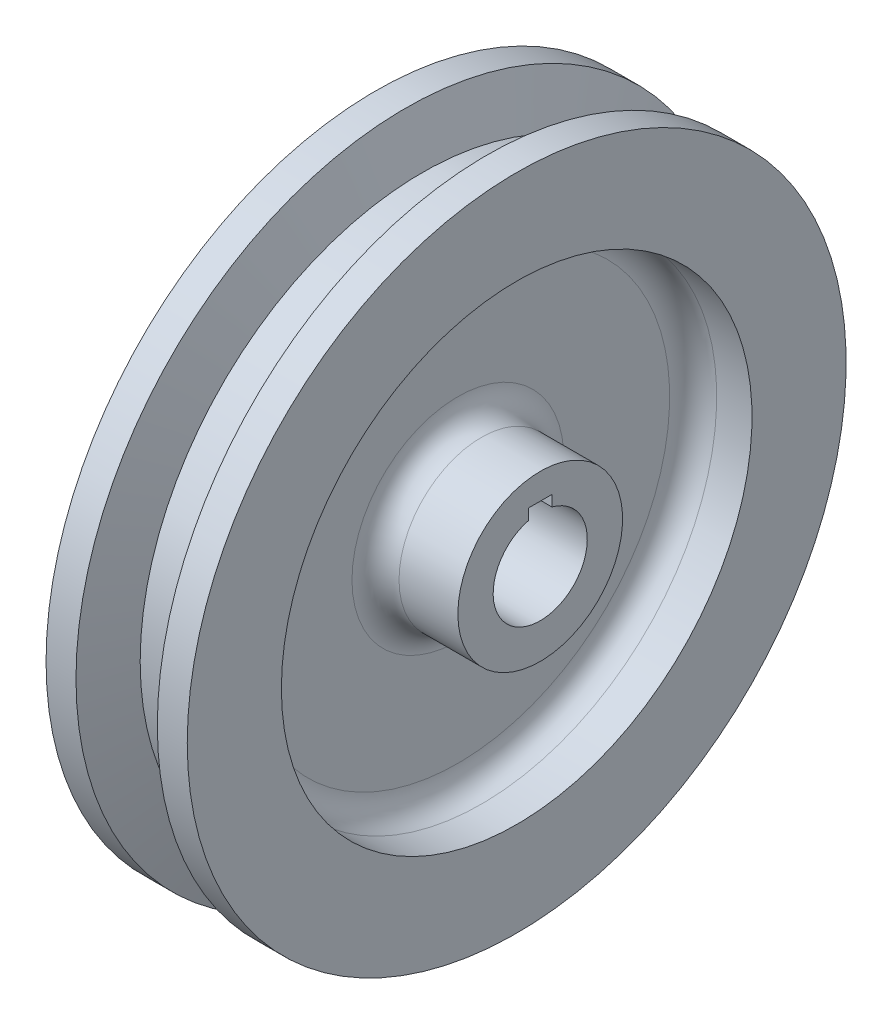
ISO-10303-21;
HEADER;
FILE_DESCRIPTION(('STEP AP214'),'2;1');
FILE_NAME('part.step','',(''),(''),'','','');
FILE_SCHEMA(('AUTOMOTIVE_DESIGN { 1 0 10303 214 1 1 1 1 }'));
ENDSEC;
DATA;
#1=APPLICATION_CONTEXT('core data for automotive mechanical design processes');
#2=APPLICATION_PROTOCOL_DEFINITION('international standard','automotive_design',2000,#1);
#3=PRODUCT_CONTEXT('',#1,'mechanical');
#4=PRODUCT('Part','Part','',(#3));
#5=PRODUCT_RELATED_PRODUCT_CATEGORY('part','',(#4));
#6=PRODUCT_DEFINITION_FORMATION('','',#4);
#7=PRODUCT_DEFINITION_CONTEXT('part definition',#1,'design');
#8=PRODUCT_DEFINITION('design','',#6,#7);
#9=PRODUCT_DEFINITION_SHAPE('','',#8);
#10=(LENGTH_UNIT() NAMED_UNIT(*) SI_UNIT(.MILLI.,.METRE.));
#11=(NAMED_UNIT(*) PLANE_ANGLE_UNIT() SI_UNIT($,.RADIAN.));
#12=(NAMED_UNIT(*) SI_UNIT($,.STERADIAN.) SOLID_ANGLE_UNIT());
#13=UNCERTAINTY_MEASURE_WITH_UNIT(LENGTH_MEASURE(1.E-05),#10,'distance_accuracy_value','');
#14=(GEOMETRIC_REPRESENTATION_CONTEXT(3) GLOBAL_UNCERTAINTY_ASSIGNED_CONTEXT((#13)) GLOBAL_UNIT_ASSIGNED_CONTEXT((#10,
#11,#12)) REPRESENTATION_CONTEXT('',''));
#15=CARTESIAN_POINT('',(0.,0.,0.));
#16=DIRECTION('',(0.,0.,1.));
#17=DIRECTION('',(1.,0.,0.));
#18=AXIS2_PLACEMENT_3D('',#15,#16,#17);
#19=CARTESIAN_POINT('',(-25.4,0.,0.));
#20=DIRECTION('',(1.,0.,0.));
#21=DIRECTION('',(0.,0.,-1.));
#22=AXIS2_PLACEMENT_3D('',#19,#20,#21);
#23=PLANE('',#22);
#24=CARTESIAN_POINT('',(-25.4,0.,0.));
#25=DIRECTION('',(-1.,0.,0.));
#26=DIRECTION('',(0.,0.,1.));
#27=AXIS2_PLACEMENT_3D('',#24,#25,#26);
#28=CIRCLE('',#27,12.7);
#29=CARTESIAN_POINT('',(-25.4,12.2967221242085,-3.175));
#30=VERTEX_POINT('',#29);
#31=CARTESIAN_POINT('',(-25.4,12.2967221242085,3.175));
#32=VERTEX_POINT('',#31);
#33=EDGE_CURVE('E115',#30,#32,#28,.T.);
#34=ORIENTED_EDGE('',*,*,#33,.F.);
#35=DIRECTION('',(0.,-1.,0.));
#36=VECTOR('',#35,1.);
#37=CARTESIAN_POINT('',(-25.4,15.24,-3.175));
#38=LINE('',#37,#36);
#39=CARTESIAN_POINT('',(-25.4,15.24,-3.175));
#40=VERTEX_POINT('',#39);
#41=EDGE_CURVE('E55',#40,#30,#38,.T.);
#42=ORIENTED_EDGE('',*,*,#41,.F.);
#43=DIRECTION('',(0.,0.,-1.));
#44=VECTOR('',#43,1.);
#45=CARTESIAN_POINT('',(-25.4,15.24,-3.175));
#46=LINE('',#45,#44);
#47=CARTESIAN_POINT('',(-25.4,15.24,3.175));
#48=VERTEX_POINT('',#47);
#49=EDGE_CURVE('E102',#48,#40,#46,.T.);
#50=ORIENTED_EDGE('',*,*,#49,.F.);
#51=DIRECTION('',(0.,1.,0.));
#52=VECTOR('',#51,1.);
#53=CARTESIAN_POINT('',(-25.4,15.24,3.175));
#54=LINE('',#53,#52);
#55=EDGE_CURVE('E106',#32,#48,#54,.T.);
#56=ORIENTED_EDGE('',*,*,#55,.F.);
#57=EDGE_LOOP('',(#34,#42,#50,#56));
#58=FACE_BOUND('',#57,.T.);
#59=CARTESIAN_POINT('',(-25.4,0.,0.));
#60=DIRECTION('',(-1.,0.,0.));
#61=DIRECTION('',(0.,0.,1.));
#62=AXIS2_PLACEMENT_3D('',#59,#60,#61);
#63=CIRCLE('',#62,22.225);
#64=CARTESIAN_POINT('',(-25.4,0.,22.225));
#65=VERTEX_POINT('',#64);
#66=EDGE_CURVE('E165',#65,#65,#63,.T.);
#67=ORIENTED_EDGE('',*,*,#66,.T.);
#68=EDGE_LOOP('',(#67));
#69=FACE_BOUND('',#68,.T.);
#70=ADVANCED_FACE('F39',(#58,#69),#23,.F.);
#71=CARTESIAN_POINT('',(-25.4,0.,0.));
#72=DIRECTION('',(-1.,0.,0.));
#73=DIRECTION('',(0.,0.,1.));
#74=AXIS2_PLACEMENT_3D('',#71,#72,#73);
#75=CYLINDRICAL_SURFACE('',#74,22.225);
#76=CARTESIAN_POINT('',(-9.525,0.,0.));
#77=DIRECTION('',(1.,0.,0.));
#78=DIRECTION('',(0.,0.,-1.));
#79=AXIS2_PLACEMENT_3D('',#76,#77,#78);
#80=CIRCLE('',#79,22.225);
#81=CARTESIAN_POINT('',(-9.525,0.,-22.225));
#82=VERTEX_POINT('',#81);
#83=EDGE_CURVE('E181',#82,#82,#80,.F.);
#84=ORIENTED_EDGE('',*,*,#83,.T.);
#85=EDGE_LOOP('',(#84));
#86=FACE_BOUND('',#85,.T.);
#87=ORIENTED_EDGE('',*,*,#66,.F.);
#88=EDGE_LOOP('',(#87));
#89=FACE_BOUND('',#88,.T.);
#90=ADVANCED_FACE('F224',(#86,#89),#75,.T.);
#91=CARTESIAN_POINT('',(-3.175,22.225,0.));
#92=DIRECTION('',(1.,0.,0.));
#93=DIRECTION('',(0.,0.,-1.));
#94=AXIS2_PLACEMENT_3D('',#91,#92,#93);
#95=PLANE('',#94);
#96=CARTESIAN_POINT('',(-3.175,0.,0.));
#97=DIRECTION('',(1.,0.,0.));
#98=DIRECTION('',(0.,0.,-1.));
#99=AXIS2_PLACEMENT_3D('',#96,#97,#98);
#100=CIRCLE('',#99,57.15);
#101=CARTESIAN_POINT('',(-3.175,0.,-57.15));
#102=VERTEX_POINT('',#101);
#103=EDGE_CURVE('E173',#102,#102,#100,.F.);
#104=ORIENTED_EDGE('',*,*,#103,.T.);
#105=EDGE_LOOP('',(#104));
#106=FACE_BOUND('',#105,.T.);
#107=CARTESIAN_POINT('',(-3.175,0.,0.));
#108=DIRECTION('',(1.,0.,0.));
#109=DIRECTION('',(0.,0.,-1.));
#110=AXIS2_PLACEMENT_3D('',#107,#108,#109);
#111=CIRCLE('',#110,28.575);
#112=CARTESIAN_POINT('',(-3.175,0.,-28.575));
#113=VERTEX_POINT('',#112);
#114=EDGE_CURVE('E169',#113,#113,#111,.T.);
#115=ORIENTED_EDGE('',*,*,#114,.T.);
#116=EDGE_LOOP('',(#115));
#117=FACE_BOUND('',#116,.T.);
#118=ADVANCED_FACE('F230',(#106,#117),#95,.F.);
#119=CARTESIAN_POINT('',(-25.4,0.,0.));
#120=DIRECTION('',(-1.,0.,0.));
#121=DIRECTION('',(0.,0.,1.));
#122=AXIS2_PLACEMENT_3D('',#119,#120,#121);
#123=CYLINDRICAL_SURFACE('',#122,63.5);
#124=CARTESIAN_POINT('',(-9.525,0.,0.));
#125=DIRECTION('',(1.,0.,0.));
#126=DIRECTION('',(0.,0.,-1.));
#127=AXIS2_PLACEMENT_3D('',#124,#125,#126);
#128=CIRCLE('',#127,63.5);
#129=CARTESIAN_POINT('',(-9.525,0.,-63.5));
#130=VERTEX_POINT('',#129);
#131=EDGE_CURVE('E177',#130,#130,#128,.T.);
#132=ORIENTED_EDGE('',*,*,#131,.T.);
#133=EDGE_LOOP('',(#132));
#134=FACE_BOUND('',#133,.T.);
#135=CARTESIAN_POINT('',(-19.05,0.,0.));
#136=DIRECTION('',(-1.,0.,0.));
#137=DIRECTION('',(0.,0.,1.));
#138=AXIS2_PLACEMENT_3D('',#135,#136,#137);
#139=CIRCLE('',#138,63.5);
#140=CARTESIAN_POINT('',(-19.05,0.,63.5));
#141=VERTEX_POINT('',#140);
#142=EDGE_CURVE('E161',#141,#141,#139,.T.);
#143=ORIENTED_EDGE('',*,*,#142,.T.);
#144=EDGE_LOOP('',(#143));
#145=FACE_BOUND('',#144,.T.);
#146=ADVANCED_FACE('F251',(#134,#145),#123,.F.);
#147=CARTESIAN_POINT('',(-19.05,63.5,0.));
#148=DIRECTION('',(1.,0.,0.));
#149=DIRECTION('',(0.,0.,-1.));
#150=AXIS2_PLACEMENT_3D('',#147,#148,#149);
#151=PLANE('',#150);
#152=ORIENTED_EDGE('',*,*,#142,.F.);
#153=EDGE_LOOP('',(#152));
#154=FACE_BOUND('',#153,.T.);
#155=CARTESIAN_POINT('',(-19.05,0.,0.));
#156=DIRECTION('',(-1.,0.,0.));
#157=DIRECTION('',(0.,0.,1.));
#158=AXIS2_PLACEMENT_3D('',#155,#156,#157);
#159=CIRCLE('',#158,88.9);
#160=CARTESIAN_POINT('',(-19.05,0.,88.9));
#161=VERTEX_POINT('',#160);
#162=EDGE_CURVE('E157',#161,#161,#159,.T.);
#163=ORIENTED_EDGE('',*,*,#162,.T.);
#164=EDGE_LOOP('',(#163));
#165=FACE_BOUND('',#164,.T.);
#166=ADVANCED_FACE('F256',(#154,#165),#151,.F.);
#167=CARTESIAN_POINT('',(-25.4,0.,0.));
#168=DIRECTION('',(-1.,0.,0.));
#169=DIRECTION('',(0.,0.,1.));
#170=AXIS2_PLACEMENT_3D('',#167,#168,#169);
#171=CYLINDRICAL_SURFACE('',#170,88.9);
#172=ORIENTED_EDGE('',*,*,#162,.F.);
#173=EDGE_LOOP('',(#172));
#174=FACE_BOUND('',#173,.T.);
#175=CARTESIAN_POINT('',(-10.9724219751808,0.,0.));
#176=DIRECTION('',(-1.,0.,0.));
#177=DIRECTION('',(0.,0.,1.));
#178=AXIS2_PLACEMENT_3D('',#175,#176,#177);
#179=CIRCLE('',#178,88.9);
#180=CARTESIAN_POINT('',(-10.9724219751808,0.,88.9));
#181=VERTEX_POINT('',#180);
#182=EDGE_CURVE('E153',#181,#181,#179,.T.);
#183=ORIENTED_EDGE('',*,*,#182,.T.);
#184=EDGE_LOOP('',(#183));
#185=FACE_BOUND('',#184,.T.);
#186=ADVANCED_FACE('F262',(#174,#185),#171,.T.);
#187=CARTESIAN_POINT('',(-6.35,0.,0.));
#188=DIRECTION('',(-1.,0.,0.));
#189=DIRECTION('',(0.,0.,1.));
#190=AXIS2_PLACEMENT_3D('',#187,#188,#189);
#191=CONICAL_SURFACE('',#190,76.2,1.22173047639603);
#192=ORIENTED_EDGE('',*,*,#182,.F.);
#193=EDGE_LOOP('',(#192));
#194=FACE_BOUND('',#193,.T.);
#195=CARTESIAN_POINT('',(-6.35,0.,0.));
#196=DIRECTION('',(-1.,0.,0.));
#197=DIRECTION('',(0.,0.,1.));
#198=AXIS2_PLACEMENT_3D('',#195,#196,#197);
#199=CIRCLE('',#198,76.2);
#200=CARTESIAN_POINT('',(-6.35,0.,76.2));
#201=VERTEX_POINT('',#200);
#202=EDGE_CURVE('E149',#201,#201,#199,.T.);
#203=ORIENTED_EDGE('',*,*,#202,.T.);
#204=EDGE_LOOP('',(#203));
#205=FACE_BOUND('',#204,.T.);
#206=ADVANCED_FACE('F266',(#194,#205),#191,.T.);
#207=CARTESIAN_POINT('',(-25.4,0.,0.));
#208=DIRECTION('',(-1.,0.,0.));
#209=DIRECTION('',(0.,0.,1.));
#210=AXIS2_PLACEMENT_3D('',#207,#208,#209);
#211=CYLINDRICAL_SURFACE('',#210,76.2);
#212=ORIENTED_EDGE('',*,*,#202,.F.);
#213=EDGE_LOOP('',(#212));
#214=FACE_BOUND('',#213,.T.);
#215=CARTESIAN_POINT('',(6.35,0.,0.));
#216=DIRECTION('',(-1.,0.,0.));
#217=DIRECTION('',(0.,0.,1.));
#218=AXIS2_PLACEMENT_3D('',#215,#216,#217);
#219=CIRCLE('',#218,76.2);
#220=CARTESIAN_POINT('',(6.35,0.,76.2));
#221=VERTEX_POINT('',#220);
#222=EDGE_CURVE('E145',#221,#221,#219,.T.);
#223=ORIENTED_EDGE('',*,*,#222,.T.);
#224=EDGE_LOOP('',(#223));
#225=FACE_BOUND('',#224,.T.);
#226=ADVANCED_FACE('F270',(#214,#225),#211,.T.);
#227=CARTESIAN_POINT('',(10.9724219751808,0.,0.));
#228=DIRECTION('',(1.,0.,0.));
#229=DIRECTION('',(0.,0.,-1.));
#230=AXIS2_PLACEMENT_3D('',#227,#228,#229);
#231=CONICAL_SURFACE('',#230,88.9,1.22173047639603);
#232=ORIENTED_EDGE('',*,*,#222,.F.);
#233=EDGE_LOOP('',(#232));
#234=FACE_BOUND('',#233,.T.);
#235=CARTESIAN_POINT('',(10.9724219751808,0.,0.));
#236=DIRECTION('',(-1.,0.,0.));
#237=DIRECTION('',(0.,0.,1.));
#238=AXIS2_PLACEMENT_3D('',#235,#236,#237);
#239=CIRCLE('',#238,88.9);
#240=CARTESIAN_POINT('',(10.9724219751808,0.,88.9));
#241=VERTEX_POINT('',#240);
#242=EDGE_CURVE('E141',#241,#241,#239,.T.);
#243=ORIENTED_EDGE('',*,*,#242,.T.);
#244=EDGE_LOOP('',(#243));
#245=FACE_BOUND('',#244,.T.);
#246=ADVANCED_FACE('F219',(#234,#245),#231,.T.);
#247=CARTESIAN_POINT('',(-25.4,0.,0.));
#248=DIRECTION('',(-1.,0.,0.));
#249=DIRECTION('',(0.,0.,1.));
#250=AXIS2_PLACEMENT_3D('',#247,#248,#249);
#251=CYLINDRICAL_SURFACE('',#250,88.9);
#252=ORIENTED_EDGE('',*,*,#242,.F.);
#253=EDGE_LOOP('',(#252));
#254=FACE_BOUND('',#253,.T.);
#255=CARTESIAN_POINT('',(19.05,0.,0.));
#256=DIRECTION('',(-1.,0.,0.));
#257=DIRECTION('',(0.,0.,1.));
#258=AXIS2_PLACEMENT_3D('',#255,#256,#257);
#259=CIRCLE('',#258,88.9);
#260=CARTESIAN_POINT('',(19.05,0.,88.9));
#261=VERTEX_POINT('',#260);
#262=EDGE_CURVE('E137',#261,#261,#259,.T.);
#263=ORIENTED_EDGE('',*,*,#262,.T.);
#264=EDGE_LOOP('',(#263));
#265=FACE_BOUND('',#264,.T.);
#266=ADVANCED_FACE('F213',(#254,#265),#251,.T.);
#267=CARTESIAN_POINT('',(19.05,88.9,0.));
#268=DIRECTION('',(-1.,0.,0.));
#269=DIRECTION('',(0.,0.,1.));
#270=AXIS2_PLACEMENT_3D('',#267,#268,#269);
#271=PLANE('',#270);
#272=ORIENTED_EDGE('',*,*,#262,.F.);
#273=EDGE_LOOP('',(#272));
#274=FACE_BOUND('',#273,.T.);
#275=CARTESIAN_POINT('',(19.05,0.,0.));
#276=DIRECTION('',(-1.,0.,0.));
#277=DIRECTION('',(0.,0.,1.));
#278=AXIS2_PLACEMENT_3D('',#275,#276,#277);
#279=CIRCLE('',#278,63.5);
#280=CARTESIAN_POINT('',(19.05,0.,63.5));
#281=VERTEX_POINT('',#280);
#282=EDGE_CURVE('E133',#281,#281,#279,.T.);
#283=ORIENTED_EDGE('',*,*,#282,.T.);
#284=EDGE_LOOP('',(#283));
#285=FACE_BOUND('',#284,.T.);
#286=ADVANCED_FACE('F208',(#274,#285),#271,.F.);
#287=CARTESIAN_POINT('',(-25.4,0.,0.));
#288=DIRECTION('',(-1.,0.,0.));
#289=DIRECTION('',(0.,0.,1.));
#290=AXIS2_PLACEMENT_3D('',#287,#288,#289);
#291=CYLINDRICAL_SURFACE('',#290,63.5);
#292=CARTESIAN_POINT('',(9.525,0.,0.));
#293=DIRECTION('',(-1.,0.,0.));
#294=DIRECTION('',(0.,0.,1.));
#295=AXIS2_PLACEMENT_3D('',#292,#293,#294);
#296=CIRCLE('',#295,63.5);
#297=CARTESIAN_POINT('',(9.525,0.,63.5));
#298=VERTEX_POINT('',#297);
#299=EDGE_CURVE('E185',#298,#298,#296,.T.);
#300=ORIENTED_EDGE('',*,*,#299,.T.);
#301=EDGE_LOOP('',(#300));
#302=FACE_BOUND('',#301,.T.);
#303=ORIENTED_EDGE('',*,*,#282,.F.);
#304=EDGE_LOOP('',(#303));
#305=FACE_BOUND('',#304,.T.);
#306=ADVANCED_FACE('F205',(#302,#305),#291,.F.);
#307=CARTESIAN_POINT('',(3.175,22.225,0.));
#308=DIRECTION('',(-1.,0.,0.));
#309=DIRECTION('',(0.,0.,1.));
#310=AXIS2_PLACEMENT_3D('',#307,#308,#309);
#311=PLANE('',#310);
#312=CARTESIAN_POINT('',(3.175,0.,0.));
#313=DIRECTION('',(-1.,0.,0.));
#314=DIRECTION('',(0.,0.,1.));
#315=AXIS2_PLACEMENT_3D('',#312,#313,#314);
#316=CIRCLE('',#315,57.15);
#317=CARTESIAN_POINT('',(3.175,0.,57.15));
#318=VERTEX_POINT('',#317);
#319=EDGE_CURVE('E48',#318,#318,#316,.F.);
#320=ORIENTED_EDGE('',*,*,#319,.T.);
#321=EDGE_LOOP('',(#320));
#322=FACE_BOUND('',#321,.T.);
#323=CARTESIAN_POINT('',(3.175,0.,0.));
#324=DIRECTION('',(-1.,0.,0.));
#325=DIRECTION('',(0.,0.,1.));
#326=AXIS2_PLACEMENT_3D('',#323,#324,#325);
#327=CIRCLE('',#326,28.575);
#328=CARTESIAN_POINT('',(3.175,0.,28.575));
#329=VERTEX_POINT('',#328);
#330=EDGE_CURVE('E189',#329,#329,#327,.T.);
#331=ORIENTED_EDGE('',*,*,#330,.T.);
#332=EDGE_LOOP('',(#331));
#333=FACE_BOUND('',#332,.T.);
#334=ADVANCED_FACE('F196',(#322,#333),#311,.F.);
#335=CARTESIAN_POINT('',(-25.4,0.,0.));
#336=DIRECTION('',(-1.,0.,0.));
#337=DIRECTION('',(0.,0.,1.));
#338=AXIS2_PLACEMENT_3D('',#335,#336,#337);
#339=CYLINDRICAL_SURFACE('',#338,22.225);
#340=CARTESIAN_POINT('',(9.525,0.,0.));
#341=DIRECTION('',(-1.,0.,0.));
#342=DIRECTION('',(0.,0.,1.));
#343=AXIS2_PLACEMENT_3D('',#340,#341,#342);
#344=CIRCLE('',#343,22.225);
#345=CARTESIAN_POINT('',(9.525,0.,22.225));
#346=VERTEX_POINT('',#345);
#347=EDGE_CURVE('E11',#346,#346,#344,.F.);
#348=ORIENTED_EDGE('',*,*,#347,.T.);
#349=EDGE_LOOP('',(#348));
#350=FACE_BOUND('',#349,.T.);
#351=CARTESIAN_POINT('',(25.4,0.,0.));
#352=DIRECTION('',(-1.,0.,0.));
#353=DIRECTION('',(0.,0.,1.));
#354=AXIS2_PLACEMENT_3D('',#351,#352,#353);
#355=CIRCLE('',#354,22.225);
#356=CARTESIAN_POINT('',(25.4,0.,22.225));
#357=VERTEX_POINT('',#356);
#358=EDGE_CURVE('E124',#357,#357,#355,.T.);
#359=ORIENTED_EDGE('',*,*,#358,.T.);
#360=EDGE_LOOP('',(#359));
#361=FACE_BOUND('',#360,.T.);
#362=ADVANCED_FACE('F327',(#350,#361),#339,.T.);
#363=CARTESIAN_POINT('',(25.4,0.,0.));
#364=DIRECTION('',(-1.,0.,0.));
#365=DIRECTION('',(0.,0.,1.));
#366=AXIS2_PLACEMENT_3D('',#363,#364,#365);
#367=PLANE('',#366);
#368=DIRECTION('',(0.,0.,-1.));
#369=VECTOR('',#368,1.);
#370=CARTESIAN_POINT('',(25.4,15.24,-3.175));
#371=LINE('',#370,#369);
#372=CARTESIAN_POINT('',(25.4,15.24,3.175));
#373=VERTEX_POINT('',#372);
#374=CARTESIAN_POINT('',(25.4,15.24,-3.175));
#375=VERTEX_POINT('',#374);
#376=EDGE_CURVE('E90',#373,#375,#371,.T.);
#377=ORIENTED_EDGE('',*,*,#376,.T.);
#378=DIRECTION('',(0.,-1.,0.));
#379=VECTOR('',#378,1.);
#380=CARTESIAN_POINT('',(25.4,15.24,-3.175));
#381=LINE('',#380,#379);
#382=CARTESIAN_POINT('',(25.4,12.2967221242085,-3.175));
#383=VERTEX_POINT('',#382);
#384=EDGE_CURVE('E83',#375,#383,#381,.T.);
#385=ORIENTED_EDGE('',*,*,#384,.T.);
#386=CARTESIAN_POINT('',(25.4,0.,0.));
#387=DIRECTION('',(-1.,0.,0.));
#388=DIRECTION('',(0.,0.,1.));
#389=AXIS2_PLACEMENT_3D('',#386,#387,#388);
#390=CIRCLE('',#389,12.7);
#391=CARTESIAN_POINT('',(25.4,12.2967221242085,3.175));
#392=VERTEX_POINT('',#391);
#393=EDGE_CURVE('E93',#383,#392,#390,.T.);
#394=ORIENTED_EDGE('',*,*,#393,.T.);
#395=DIRECTION('',(0.,1.,0.));
#396=VECTOR('',#395,1.);
#397=CARTESIAN_POINT('',(25.4,15.24,3.175));
#398=LINE('',#397,#396);
#399=EDGE_CURVE('E63',#392,#373,#398,.T.);
#400=ORIENTED_EDGE('',*,*,#399,.T.);
#401=EDGE_LOOP('',(#377,#385,#394,#400));
#402=FACE_BOUND('',#401,.T.);
#403=ORIENTED_EDGE('',*,*,#358,.F.);
#404=EDGE_LOOP('',(#403));
#405=FACE_BOUND('',#404,.T.);
#406=ADVANCED_FACE('F98',(#402,#405),#367,.F.);
#407=CARTESIAN_POINT('',(-9.525,0.,0.));
#408=DIRECTION('',(1.,0.,0.));
#409=DIRECTION('',(0.,0.,-1.));
#410=AXIS2_PLACEMENT_3D('',#407,#408,#409);
#411=TOROIDAL_SURFACE('',#410,57.15,6.35);
#412=ORIENTED_EDGE('',*,*,#131,.F.);
#413=EDGE_LOOP('',(#412));
#414=FACE_BOUND('',#413,.T.);
#415=ORIENTED_EDGE('',*,*,#103,.F.);
#416=EDGE_LOOP('',(#415));
#417=FACE_BOUND('',#416,.T.);
#418=ADVANCED_FACE('F236',(#414,#417),#411,.F.);
#419=CARTESIAN_POINT('',(-9.525,0.,0.));
#420=DIRECTION('',(1.,0.,0.));
#421=DIRECTION('',(0.,0.,-1.));
#422=AXIS2_PLACEMENT_3D('',#419,#420,#421);
#423=TOROIDAL_SURFACE('',#422,28.575,6.35);
#424=ORIENTED_EDGE('',*,*,#114,.F.);
#425=EDGE_LOOP('',(#424));
#426=FACE_BOUND('',#425,.T.);
#427=ORIENTED_EDGE('',*,*,#83,.F.);
#428=EDGE_LOOP('',(#427));
#429=FACE_BOUND('',#428,.T.);
#430=ADVANCED_FACE('F202',(#426,#429),#423,.F.);
#431=CARTESIAN_POINT('',(9.525,0.,0.));
#432=DIRECTION('',(-1.,0.,0.));
#433=DIRECTION('',(0.,0.,1.));
#434=AXIS2_PLACEMENT_3D('',#431,#432,#433);
#435=TOROIDAL_SURFACE('',#434,57.15,6.35);
#436=ORIENTED_EDGE('',*,*,#319,.F.);
#437=EDGE_LOOP('',(#436));
#438=FACE_BOUND('',#437,.T.);
#439=ORIENTED_EDGE('',*,*,#299,.F.);
#440=EDGE_LOOP('',(#439));
#441=FACE_BOUND('',#440,.T.);
#442=ADVANCED_FACE('F199',(#438,#441),#435,.F.);
#443=CARTESIAN_POINT('',(9.525,0.,0.));
#444=DIRECTION('',(-1.,0.,0.));
#445=DIRECTION('',(0.,0.,1.));
#446=AXIS2_PLACEMENT_3D('',#443,#444,#445);
#447=TOROIDAL_SURFACE('',#446,28.575,6.35);
#448=ORIENTED_EDGE('',*,*,#347,.F.);
#449=EDGE_LOOP('',(#448));
#450=FACE_BOUND('',#449,.T.);
#451=ORIENTED_EDGE('',*,*,#330,.F.);
#452=EDGE_LOOP('',(#451));
#453=FACE_BOUND('',#452,.T.);
#454=ADVANCED_FACE('F41',(#450,#453),#447,.F.);
#455=CARTESIAN_POINT('',(25.4,15.24,-3.175));
#456=DIRECTION('',(0.,0.,-1.));
#457=DIRECTION('',(-1.,0.,0.));
#458=AXIS2_PLACEMENT_3D('',#455,#456,#457);
#459=PLANE('',#458);
#460=ORIENTED_EDGE('',*,*,#41,.T.);
#461=DIRECTION('',(-1.,0.,0.));
#462=VECTOR('',#461,1.);
#463=CARTESIAN_POINT('',(25.4,12.2967221242085,-3.175));
#464=LINE('',#463,#462);
#465=EDGE_CURVE('E79',#383,#30,#464,.T.);
#466=ORIENTED_EDGE('',*,*,#465,.F.);
#467=ORIENTED_EDGE('',*,*,#384,.F.);
#468=DIRECTION('',(-1.,0.,0.));
#469=VECTOR('',#468,1.);
#470=CARTESIAN_POINT('',(25.4,15.24,-3.175));
#471=LINE('',#470,#469);
#472=EDGE_CURVE('E121',#375,#40,#471,.T.);
#473=ORIENTED_EDGE('',*,*,#472,.T.);
#474=EDGE_LOOP('',(#460,#466,#467,#473));
#475=FACE_BOUND('',#474,.T.);
#476=ADVANCED_FACE('F81',(#475),#459,.F.);
#477=CARTESIAN_POINT('',(25.4,15.24,-3.175));
#478=DIRECTION('',(0.,1.,0.));
#479=DIRECTION('',(0.,0.,1.));
#480=AXIS2_PLACEMENT_3D('',#477,#478,#479);
#481=PLANE('',#480);
#482=ORIENTED_EDGE('',*,*,#49,.T.);
#483=ORIENTED_EDGE('',*,*,#472,.F.);
#484=ORIENTED_EDGE('',*,*,#376,.F.);
#485=DIRECTION('',(-1.,0.,0.));
#486=VECTOR('',#485,1.);
#487=CARTESIAN_POINT('',(25.4,15.24,3.175));
#488=LINE('',#487,#486);
#489=EDGE_CURVE('E125',#373,#48,#488,.T.);
#490=ORIENTED_EDGE('',*,*,#489,.T.);
#491=EDGE_LOOP('',(#482,#483,#484,#490));
#492=FACE_BOUND('',#491,.T.);
#493=ADVANCED_FACE('F380',(#492),#481,.F.);
#494=CARTESIAN_POINT('',(25.4,15.24,3.175));
#495=DIRECTION('',(0.,0.,1.));
#496=DIRECTION('',(1.,0.,0.));
#497=AXIS2_PLACEMENT_3D('',#494,#495,#496);
#498=PLANE('',#497);
#499=ORIENTED_EDGE('',*,*,#55,.T.);
#500=ORIENTED_EDGE('',*,*,#489,.F.);
#501=ORIENTED_EDGE('',*,*,#399,.F.);
#502=DIRECTION('',(-1.,0.,0.));
#503=VECTOR('',#502,1.);
#504=CARTESIAN_POINT('',(25.4,12.2967221242085,3.175));
#505=LINE('',#504,#503);
#506=EDGE_CURVE('E89',#392,#32,#505,.T.);
#507=ORIENTED_EDGE('',*,*,#506,.T.);
#508=EDGE_LOOP('',(#499,#500,#501,#507));
#509=FACE_BOUND('',#508,.T.);
#510=ADVANCED_FACE('F389',(#509),#498,.F.);
#511=CARTESIAN_POINT('',(25.4,0.,0.));
#512=DIRECTION('',(-1.,0.,0.));
#513=DIRECTION('',(0.,0.,1.));
#514=AXIS2_PLACEMENT_3D('',#511,#512,#513);
#515=CYLINDRICAL_SURFACE('',#514,12.7);
#516=ORIENTED_EDGE('',*,*,#33,.T.);
#517=ORIENTED_EDGE('',*,*,#506,.F.);
#518=ORIENTED_EDGE('',*,*,#393,.F.);
#519=ORIENTED_EDGE('',*,*,#465,.T.);
#520=EDGE_LOOP('',(#516,#517,#518,#519));
#521=FACE_BOUND('',#520,.T.);
#522=ADVANCED_FACE('F94',(#521),#515,.F.);
#523=CLOSED_SHELL('',(#70,#90,#118,#146,#166,#186,#206,#226,#246,#266,#286,#306,#334,#362,#406,
#418,#430,#442,#454,#476,#493,#510,#522));
#524=MANIFOLD_SOLID_BREP('B2',#523);
#525=ADVANCED_BREP_SHAPE_REPRESENTATION('',(#18,#524),#14);
#526=SHAPE_DEFINITION_REPRESENTATION(#9,#525);
ENDSEC;
END-ISO-10303-21;
